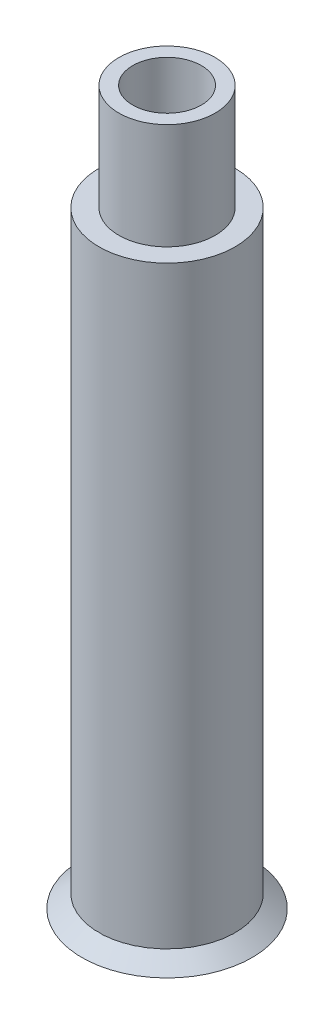
ISO-10303-21;
HEADER;
FILE_DESCRIPTION(('STEP AP214'),'2;1');
FILE_NAME('part.step','',(''),(''),'','','');
FILE_SCHEMA(('AUTOMOTIVE_DESIGN { 1 0 10303 214 1 1 1 1 }'));
ENDSEC;
DATA;
#1=APPLICATION_CONTEXT('core data for automotive mechanical design processes');
#2=APPLICATION_PROTOCOL_DEFINITION('international standard','automotive_design',2000,#1);
#3=PRODUCT_CONTEXT('',#1,'mechanical');
#4=PRODUCT('Part','Part','',(#3));
#5=PRODUCT_RELATED_PRODUCT_CATEGORY('part','',(#4));
#6=PRODUCT_DEFINITION_FORMATION('','',#4);
#7=PRODUCT_DEFINITION_CONTEXT('part definition',#1,'design');
#8=PRODUCT_DEFINITION('design','',#6,#7);
#9=PRODUCT_DEFINITION_SHAPE('','',#8);
#10=(LENGTH_UNIT() NAMED_UNIT(*) SI_UNIT(.MILLI.,.METRE.));
#11=(NAMED_UNIT(*) PLANE_ANGLE_UNIT() SI_UNIT($,.RADIAN.));
#12=(NAMED_UNIT(*) SI_UNIT($,.STERADIAN.) SOLID_ANGLE_UNIT());
#13=UNCERTAINTY_MEASURE_WITH_UNIT(LENGTH_MEASURE(1.E-05),#10,'distance_accuracy_value','');
#14=(GEOMETRIC_REPRESENTATION_CONTEXT(3) GLOBAL_UNCERTAINTY_ASSIGNED_CONTEXT((#13)) GLOBAL_UNIT_ASSIGNED_CONTEXT((#10,
#11,#12)) REPRESENTATION_CONTEXT('',''));
#15=CARTESIAN_POINT('',(0.,0.,0.));
#16=DIRECTION('',(0.,0.,1.));
#17=DIRECTION('',(1.,0.,0.));
#18=AXIS2_PLACEMENT_3D('',#15,#16,#17);
#19=CARTESIAN_POINT('',(0.,0.,0.));
#20=DIRECTION('',(0.,-1.,0.));
#21=DIRECTION('',(0.,0.,-1.));
#22=AXIS2_PLACEMENT_3D('',#19,#20,#21);
#23=CYLINDRICAL_SURFACE('',#22,3.2004);
#24=CARTESIAN_POINT('',(0.,2.27489693284656,0.));
#25=DIRECTION('',(0.,-1.,0.));
#26=DIRECTION('',(0.,0.,-1.));
#27=AXIS2_PLACEMENT_3D('',#24,#25,#26);
#28=CIRCLE('',#27,3.2004);
#29=CARTESIAN_POINT('',(0.,2.27489693284656,-3.2004));
#30=VERTEX_POINT('',#29);
#31=EDGE_CURVE('E80',#30,#30,#28,.T.);
#32=ORIENTED_EDGE('',*,*,#31,.T.);
#33=EDGE_LOOP('',(#32));
#34=FACE_BOUND('',#33,.T.);
#35=CARTESIAN_POINT('',(0.,66.5238971504627,0.));
#36=DIRECTION('',(0.,-1.,0.));
#37=DIRECTION('',(0.,0.,-1.));
#38=AXIS2_PLACEMENT_3D('',#35,#36,#37);
#39=CIRCLE('',#38,3.2004);
#40=CARTESIAN_POINT('',(0.,66.5238971504627,-3.2004));
#41=VERTEX_POINT('',#40);
#42=EDGE_CURVE('E11',#41,#41,#39,.T.);
#43=ORIENTED_EDGE('',*,*,#42,.F.);
#44=EDGE_LOOP('',(#43));
#45=FACE_BOUND('',#44,.T.);
#46=ADVANCED_FACE('F55',(#34,#45),#23,.F.);
#47=CARTESIAN_POINT('',(0.,66.5238971504627,0.));
#48=DIRECTION('',(0.,1.,0.));
#49=DIRECTION('',(0.,0.,1.));
#50=AXIS2_PLACEMENT_3D('',#47,#48,#49);
#51=PLANE('',#50);
#52=ORIENTED_EDGE('',*,*,#42,.T.);
#53=EDGE_LOOP('',(#52));
#54=FACE_BOUND('',#53,.T.);
#55=CARTESIAN_POINT('',(0.,66.5238971504627,0.));
#56=DIRECTION('',(0.,-1.,0.));
#57=DIRECTION('',(0.,0.,-1.));
#58=AXIS2_PLACEMENT_3D('',#55,#56,#57);
#59=CIRCLE('',#58,4.4958);
#60=CARTESIAN_POINT('',(0.,66.5238971504627,-4.4958));
#61=VERTEX_POINT('',#60);
#62=EDGE_CURVE('E61',#61,#61,#59,.T.);
#63=ORIENTED_EDGE('',*,*,#62,.F.);
#64=EDGE_LOOP('',(#63));
#65=FACE_BOUND('',#64,.T.);
#66=ADVANCED_FACE('F98',(#54,#65),#51,.T.);
#67=CARTESIAN_POINT('',(0.,0.,0.));
#68=DIRECTION('',(0.,-1.,0.));
#69=DIRECTION('',(0.,0.,-1.));
#70=AXIS2_PLACEMENT_3D('',#67,#68,#69);
#71=CYLINDRICAL_SURFACE('',#70,4.4958);
#72=ORIENTED_EDGE('',*,*,#62,.T.);
#73=EDGE_LOOP('',(#72));
#74=FACE_BOUND('',#73,.T.);
#75=CARTESIAN_POINT('',(0.,2.66502498931262,0.));
#76=DIRECTION('',(0.,-1.,0.));
#77=DIRECTION('',(0.,0.,-1.));
#78=AXIS2_PLACEMENT_3D('',#75,#76,#77);
#79=CIRCLE('',#78,4.4958);
#80=CARTESIAN_POINT('',(0.,2.66502498931262,-4.4958));
#81=VERTEX_POINT('',#80);
#82=EDGE_CURVE('E65',#81,#81,#79,.T.);
#83=ORIENTED_EDGE('',*,*,#82,.F.);
#84=EDGE_LOOP('',(#83));
#85=FACE_BOUND('',#84,.T.);
#86=ADVANCED_FACE('F102',(#74,#85),#71,.T.);
#87=CARTESIAN_POINT('',(0.,2.66502498931262,0.));
#88=DIRECTION('',(0.,-1.,0.));
#89=DIRECTION('',(0.,0.,-1.));
#90=AXIS2_PLACEMENT_3D('',#87,#88,#89);
#91=CONICAL_SURFACE('',#90,4.4958,0.911902541605617);
#92=CARTESIAN_POINT('',(0.,0.,0.));
#93=DIRECTION('',(0.,-1.,0.));
#94=DIRECTION('',(0.,0.,-1.));
#95=AXIS2_PLACEMENT_3D('',#92,#93,#94);
#96=CIRCLE('',#95,7.9375);
#97=CARTESIAN_POINT('',(0.,0.,-7.9375));
#98=VERTEX_POINT('',#97);
#99=EDGE_CURVE('E69',#98,#98,#96,.T.);
#100=ORIENTED_EDGE('',*,*,#99,.F.);
#101=EDGE_LOOP('',(#100));
#102=FACE_BOUND('',#101,.T.);
#103=ORIENTED_EDGE('',*,*,#82,.T.);
#104=EDGE_LOOP('',(#103));
#105=FACE_BOUND('',#104,.T.);
#106=ADVANCED_FACE('F106',(#102,#105),#91,.T.);
#107=CARTESIAN_POINT('',(0.,0.,0.));
#108=DIRECTION('',(0.,1.,0.));
#109=DIRECTION('',(0.,0.,1.));
#110=AXIS2_PLACEMENT_3D('',#107,#108,#109);
#111=PLANE('',#110);
#112=CARTESIAN_POINT('',(0.,0.,0.));
#113=DIRECTION('',(0.,-1.,0.));
#114=DIRECTION('',(0.,0.,-1.));
#115=AXIS2_PLACEMENT_3D('',#112,#113,#114);
#116=CIRCLE('',#115,7.8359);
#117=CARTESIAN_POINT('',(0.,0.,-7.8359));
#118=VERTEX_POINT('',#117);
#119=EDGE_CURVE('E74',#118,#118,#116,.T.);
#120=ORIENTED_EDGE('',*,*,#119,.F.);
#121=EDGE_LOOP('',(#120));
#122=FACE_BOUND('',#121,.T.);
#123=ORIENTED_EDGE('',*,*,#99,.T.);
#124=EDGE_LOOP('',(#123));
#125=FACE_BOUND('',#124,.T.);
#126=ADVANCED_FACE('F94',(#122,#125),#111,.F.);
#127=CARTESIAN_POINT('',(0.,2.27489693284656,0.));
#128=DIRECTION('',(0.,-1.,0.));
#129=DIRECTION('',(0.,0.,-1.));
#130=AXIS2_PLACEMENT_3D('',#127,#128,#129);
#131=CONICAL_SURFACE('',#130,4.17353570899211,1.01496652929471);
#132=ORIENTED_EDGE('',*,*,#119,.T.);
#133=EDGE_LOOP('',(#132));
#134=FACE_BOUND('',#133,.T.);
#135=CARTESIAN_POINT('',(0.,2.27489693284656,0.));
#136=DIRECTION('',(0.,-1.,0.));
#137=DIRECTION('',(0.,0.,-1.));
#138=AXIS2_PLACEMENT_3D('',#135,#136,#137);
#139=CIRCLE('',#138,4.17353570899211);
#140=CARTESIAN_POINT('',(0.,2.27489693284656,-4.17353570899211));
#141=VERTEX_POINT('',#140);
#142=EDGE_CURVE('E77',#141,#141,#139,.T.);
#143=ORIENTED_EDGE('',*,*,#142,.F.);
#144=EDGE_LOOP('',(#143));
#145=FACE_BOUND('',#144,.T.);
#146=ADVANCED_FACE('F88',(#134,#145),#131,.F.);
#147=CARTESIAN_POINT('',(0.,2.27489693284656,0.));
#148=DIRECTION('',(0.,-1.,0.));
#149=DIRECTION('',(0.,0.,-1.));
#150=AXIS2_PLACEMENT_3D('',#147,#148,#149);
#151=PLANE('',#150);
#152=ORIENTED_EDGE('',*,*,#142,.T.);
#153=EDGE_LOOP('',(#152));
#154=FACE_BOUND('',#153,.T.);
#155=ORIENTED_EDGE('',*,*,#31,.F.);
#156=EDGE_LOOP('',(#155));
#157=FACE_BOUND('',#156,.T.);
#158=ADVANCED_FACE('F86',(#154,#157),#151,.T.);
#159=CLOSED_SHELL('',(#46,#66,#86,#106,#126,#146,#158));
#160=MANIFOLD_SOLID_BREP('B2',#159);
#161=CARTESIAN_POINT('',(0.,56.642,0.));
#162=DIRECTION('',(0.,-1.,0.));
#163=DIRECTION('',(0.,0.,-1.));
#164=AXIS2_PLACEMENT_3D('',#161,#162,#163);
#165=CYLINDRICAL_SURFACE('',#164,6.35);
#166=CARTESIAN_POINT('',(0.,56.642,0.));
#167=DIRECTION('',(0.,1.,0.));
#168=DIRECTION('',(0.,0.,1.));
#169=AXIS2_PLACEMENT_3D('',#166,#167,#168);
#170=CIRCLE('',#169,6.35);
#171=CARTESIAN_POINT('',(0.,56.642,-6.35));
#172=VERTEX_POINT('',#171);
#173=EDGE_CURVE('E54',#172,#172,#170,.T.);
#174=CARTESIAN_POINT('',(0.,0.,0.));
#175=DIRECTION('',(0.,1.,0.));
#176=DIRECTION('',(0.,0.,1.));
#177=AXIS2_PLACEMENT_3D('',#174,#175,#176);
#178=CIRCLE('',#177,6.35);
#179=CARTESIAN_POINT('',(0.,0.,-6.35));
#180=VERTEX_POINT('',#179);
#181=EDGE_CURVE('E174',#180,#180,#178,.T.);
#182=CARTESIAN_POINT('',(0.,56.642,-6.35));
#183=CARTESIAN_POINT('',(0.,56.0519791666667,-6.35));
#184=CARTESIAN_POINT('',(0.,55.4619583333333,-6.35));
#185=CARTESIAN_POINT('',(0.,54.2819166666667,-6.35));
#186=CARTESIAN_POINT('',(0.,53.6918958333333,-6.35));
#187=CARTESIAN_POINT('',(0.,52.5118541666667,-6.35));
#188=CARTESIAN_POINT('',(0.,51.9218333333333,-6.35));
#189=CARTESIAN_POINT('',(0.,50.7417916666667,-6.35));
#190=CARTESIAN_POINT('',(0.,50.1517708333333,-6.35));
#191=CARTESIAN_POINT('',(0.,48.9717291666667,-6.35));
#192=CARTESIAN_POINT('',(0.,48.3817083333333,-6.35));
#193=CARTESIAN_POINT('',(0.,47.2016666666667,-6.35));
#194=CARTESIAN_POINT('',(0.,46.6116458333333,-6.35));
#195=CARTESIAN_POINT('',(0.,45.4316041666667,-6.35));
#196=CARTESIAN_POINT('',(0.,44.8415833333333,-6.35));
#197=CARTESIAN_POINT('',(0.,43.6615416666667,-6.35));
#198=CARTESIAN_POINT('',(0.,43.0715208333333,-6.35));
#199=CARTESIAN_POINT('',(0.,41.8914791666667,-6.35));
#200=CARTESIAN_POINT('',(0.,41.3014583333333,-6.35));
#201=CARTESIAN_POINT('',(0.,40.1214166666667,-6.35));
#202=CARTESIAN_POINT('',(0.,39.5313958333333,-6.35));
#203=CARTESIAN_POINT('',(0.,38.3513541666667,-6.35));
#204=CARTESIAN_POINT('',(0.,37.7613333333333,-6.35));
#205=CARTESIAN_POINT('',(0.,36.5812916666667,-6.35));
#206=CARTESIAN_POINT('',(0.,35.9912708333333,-6.35));
#207=CARTESIAN_POINT('',(0.,34.8112291666667,-6.35));
#208=CARTESIAN_POINT('',(0.,34.2212083333333,-6.35));
#209=CARTESIAN_POINT('',(0.,33.0411666666667,-6.35));
#210=CARTESIAN_POINT('',(0.,32.4511458333333,-6.35));
#211=CARTESIAN_POINT('',(0.,31.2711041666667,-6.35));
#212=CARTESIAN_POINT('',(0.,30.6810833333333,-6.35));
#213=CARTESIAN_POINT('',(0.,29.5010416666667,-6.35));
#214=CARTESIAN_POINT('',(0.,28.9110208333333,-6.35));
#215=CARTESIAN_POINT('',(0.,27.7309791666667,-6.35));
#216=CARTESIAN_POINT('',(0.,27.1409583333333,-6.35));
#217=CARTESIAN_POINT('',(0.,25.9609166666667,-6.35));
#218=CARTESIAN_POINT('',(0.,25.3708958333333,-6.35));
#219=CARTESIAN_POINT('',(0.,24.1908541666667,-6.35));
#220=CARTESIAN_POINT('',(0.,23.6008333333333,-6.35));
#221=CARTESIAN_POINT('',(0.,22.4207916666667,-6.35));
#222=CARTESIAN_POINT('',(0.,21.8307708333333,-6.35));
#223=CARTESIAN_POINT('',(0.,20.6507291666667,-6.35));
#224=CARTESIAN_POINT('',(0.,20.0607083333333,-6.35));
#225=CARTESIAN_POINT('',(0.,18.8806666666667,-6.35));
#226=CARTESIAN_POINT('',(0.,18.2906458333333,-6.35));
#227=CARTESIAN_POINT('',(0.,17.1106041666667,-6.35));
#228=CARTESIAN_POINT('',(0.,16.5205833333333,-6.35));
#229=CARTESIAN_POINT('',(0.,15.3405416666667,-6.35));
#230=CARTESIAN_POINT('',(0.,14.7505208333333,-6.35));
#231=CARTESIAN_POINT('',(0.,13.5704791666667,-6.35));
#232=CARTESIAN_POINT('',(0.,12.9804583333333,-6.35));
#233=CARTESIAN_POINT('',(0.,11.8004166666667,-6.35));
#234=CARTESIAN_POINT('',(0.,11.2103958333333,-6.35));
#235=CARTESIAN_POINT('',(0.,10.0303541666667,-6.35));
#236=CARTESIAN_POINT('',(0.,9.44033333333333,-6.35));
#237=CARTESIAN_POINT('',(0.,8.26029166666666,-6.35));
#238=CARTESIAN_POINT('',(0.,7.67027083333333,-6.35));
#239=CARTESIAN_POINT('',(0.,6.49022916666666,-6.35));
#240=CARTESIAN_POINT('',(0.,5.90020833333333,-6.35));
#241=CARTESIAN_POINT('',(0.,4.72016666666666,-6.35));
#242=CARTESIAN_POINT('',(0.,4.13014583333332,-6.35));
#243=CARTESIAN_POINT('',(0.,2.95010416666666,-6.35));
#244=CARTESIAN_POINT('',(0.,2.36008333333333,-6.35));
#245=CARTESIAN_POINT('',(0.,1.18004166666666,-6.35));
#246=CARTESIAN_POINT('',(0.,0.590020833333326,-6.35));
#247=CARTESIAN_POINT('',(0.,0.,-6.35));
#248=B_SPLINE_CURVE_WITH_KNOTS('',3,(#182,#183,#184,#185,#186,#187,#188,#189,#190,#191,#192,
#193,#194,#195,#196,#197,#198,#199,#200,#201,#202,#203,#204,#205,#206,#207,#208,#209,#210,#211,
#212,#213,#214,#215,#216,#217,#218,#219,#220,#221,#222,#223,#224,#225,#226,#227,#228,#229,#230,
#231,#232,#233,#234,#235,#236,#237,#238,#239,#240,#241,#242,#243,#244,#245,#246,#247),
.UNSPECIFIED.,.F.,.F.,(4,2,2,2,2,2,2,2,2,2,2,2,2,2,2,2,2,2,2,2,2,2,2,2,2,2,2,2,2,2,2,2,4),(0.,
1.7700625,3.540125,5.3101875,7.08025,8.8503125,10.620375,12.3904375,14.1605,15.9305625,
17.700625,19.4706875,21.24075,23.0108125,24.780875,26.5509375,28.321,30.0910625,31.861125,
33.6311875,35.40125,37.1713125,38.941375,40.7114375,42.4815,44.2515625,46.021625,47.7916875,
49.56175,51.3318125,53.101875,54.8719375,56.642),.UNSPECIFIED.);
#249=EDGE_CURVE('BSEAM171',#172,#180,#248,.T.);
#250=ORIENTED_EDGE('',*,*,#173,.F.);
#251=ORIENTED_EDGE('',*,*,#181,.T.);
#252=ORIENTED_EDGE('',*,*,#249,.T.);
#253=ORIENTED_EDGE('',*,*,#249,.F.);
#254=EDGE_LOOP('',(#250,#252,#251,#253));
#255=FACE_BOUND('',#254,.T.);
#256=ADVANCED_FACE('F171',(#255),#165,.T.);
#257=CARTESIAN_POINT('',(0.,56.642,0.));
#258=DIRECTION('',(0.,1.,0.));
#259=DIRECTION('',(0.,0.,1.));
#260=AXIS2_PLACEMENT_3D('',#257,#258,#259);
#261=PLANE('',#260);
#262=ORIENTED_EDGE('',*,*,#173,.T.);
#263=EDGE_LOOP('',(#262));
#264=FACE_BOUND('',#263,.T.);
#265=ADVANCED_FACE('F186',(#264),#261,.T.);
#266=CARTESIAN_POINT('',(0.,0.,0.));
#267=DIRECTION('',(0.,1.,0.));
#268=DIRECTION('',(0.,0.,1.));
#269=AXIS2_PLACEMENT_3D('',#266,#267,#268);
#270=PLANE('',#269);
#271=ORIENTED_EDGE('',*,*,#181,.F.);
#272=EDGE_LOOP('',(#271));
#273=FACE_BOUND('',#272,.T.);
#274=ADVANCED_FACE('F184',(#273),#270,.F.);
#275=CLOSED_SHELL('',(#256,#265,#274));
#276=MANIFOLD_SOLID_BREP('B6_NOT_SHOWN',#275);
#277=ADVANCED_BREP_SHAPE_REPRESENTATION('',(#18,#160,#276),#14);
#278=SHAPE_DEFINITION_REPRESENTATION(#9,#277);
ENDSEC;
END-ISO-10303-21;
